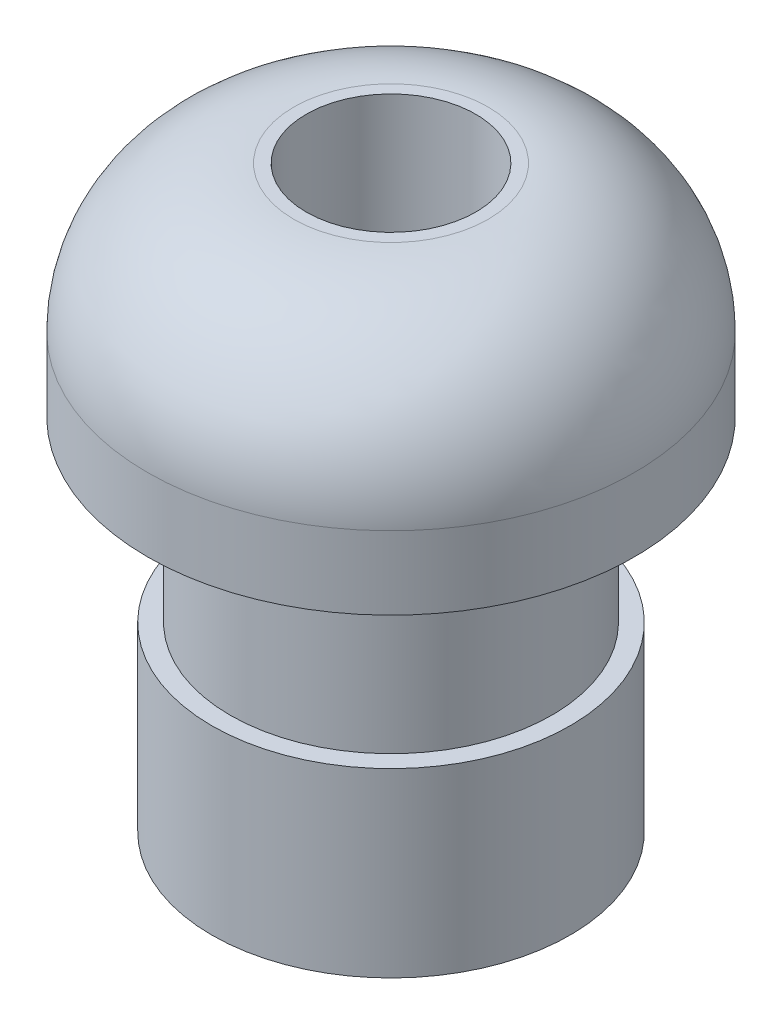
ISO-10303-21;
HEADER;
FILE_DESCRIPTION(('STEP AP214'),'2;1');
FILE_NAME('part.step','',(''),(''),'','','');
FILE_SCHEMA(('AUTOMOTIVE_DESIGN { 1 0 10303 214 1 1 1 1 }'));
ENDSEC;
DATA;
#1=APPLICATION_CONTEXT('core data for automotive mechanical design processes');
#2=APPLICATION_PROTOCOL_DEFINITION('international standard','automotive_design',2000,#1);
#3=PRODUCT_CONTEXT('',#1,'mechanical');
#4=PRODUCT('Part','Part','',(#3));
#5=PRODUCT_RELATED_PRODUCT_CATEGORY('part','',(#4));
#6=PRODUCT_DEFINITION_FORMATION('','',#4);
#7=PRODUCT_DEFINITION_CONTEXT('part definition',#1,'design');
#8=PRODUCT_DEFINITION('design','',#6,#7);
#9=PRODUCT_DEFINITION_SHAPE('','',#8);
#10=(LENGTH_UNIT() NAMED_UNIT(*) SI_UNIT(.MILLI.,.METRE.));
#11=(NAMED_UNIT(*) PLANE_ANGLE_UNIT() SI_UNIT($,.RADIAN.));
#12=(NAMED_UNIT(*) SI_UNIT($,.STERADIAN.) SOLID_ANGLE_UNIT());
#13=UNCERTAINTY_MEASURE_WITH_UNIT(LENGTH_MEASURE(1.E-05),#10,'distance_accuracy_value','');
#14=(GEOMETRIC_REPRESENTATION_CONTEXT(3) GLOBAL_UNCERTAINTY_ASSIGNED_CONTEXT((#13)) GLOBAL_UNIT_ASSIGNED_CONTEXT((#10,
#11,#12)) REPRESENTATION_CONTEXT('',''));
#15=CARTESIAN_POINT('',(0.,0.,0.));
#16=DIRECTION('',(0.,0.,1.));
#17=DIRECTION('',(1.,0.,0.));
#18=AXIS2_PLACEMENT_3D('',#15,#16,#17);
#19=CARTESIAN_POINT('',(0.,3.1496,0.));
#20=DIRECTION('',(0.,-1.,0.));
#21=DIRECTION('',(0.,0.,-1.));
#22=AXIS2_PLACEMENT_3D('',#19,#20,#21);
#23=CYLINDRICAL_SURFACE('',#22,3.1115);
#24=CARTESIAN_POINT('',(0.,3.1496,0.));
#25=DIRECTION('',(0.,1.,0.));
#26=DIRECTION('',(0.,0.,1.));
#27=AXIS2_PLACEMENT_3D('',#24,#25,#26);
#28=CIRCLE('',#27,3.1115);
#29=CARTESIAN_POINT('',(0.,3.1496,3.1115));
#30=VERTEX_POINT('',#29);
#31=EDGE_CURVE('E46',#30,#30,#28,.T.);
#32=ORIENTED_EDGE('',*,*,#31,.F.);
#33=EDGE_LOOP('',(#32));
#34=FACE_BOUND('',#33,.T.);
#35=CARTESIAN_POINT('',(0.,0.,0.));
#36=DIRECTION('',(0.,1.,0.));
#37=DIRECTION('',(0.,0.,1.));
#38=AXIS2_PLACEMENT_3D('',#35,#36,#37);
#39=CIRCLE('',#38,3.1115);
#40=CARTESIAN_POINT('',(0.,0.,3.1115));
#41=VERTEX_POINT('',#40);
#42=EDGE_CURVE('E54',#41,#41,#39,.T.);
#43=ORIENTED_EDGE('',*,*,#42,.T.);
#44=EDGE_LOOP('',(#43));
#45=FACE_BOUND('',#44,.T.);
#46=ADVANCED_FACE('F31',(#34,#45),#23,.T.);
#47=CARTESIAN_POINT('',(0.,3.1496,0.));
#48=DIRECTION('',(0.,1.,0.));
#49=DIRECTION('',(0.,0.,1.));
#50=AXIS2_PLACEMENT_3D('',#47,#48,#49);
#51=PLANE('',#50);
#52=CARTESIAN_POINT('',(0.,3.1496,0.));
#53=DIRECTION('',(0.,1.,0.));
#54=DIRECTION('',(0.,0.,1.));
#55=AXIS2_PLACEMENT_3D('',#52,#53,#54);
#56=CIRCLE('',#55,2.794);
#57=CARTESIAN_POINT('',(0.,3.1496,2.794));
#58=VERTEX_POINT('',#57);
#59=EDGE_CURVE('E42',#58,#58,#56,.T.);
#60=ORIENTED_EDGE('',*,*,#59,.F.);
#61=EDGE_LOOP('',(#60));
#62=FACE_BOUND('',#61,.T.);
#63=ORIENTED_EDGE('',*,*,#31,.T.);
#64=EDGE_LOOP('',(#63));
#65=FACE_BOUND('',#64,.T.);
#66=ADVANCED_FACE('F85',(#62,#65),#51,.T.);
#67=CARTESIAN_POINT('',(0.,0.,0.));
#68=DIRECTION('',(0.,1.,0.));
#69=DIRECTION('',(0.,0.,1.));
#70=AXIS2_PLACEMENT_3D('',#67,#68,#69);
#71=PLANE('',#70);
#72=CARTESIAN_POINT('',(0.,0.,0.));
#73=DIRECTION('',(0.,1.,0.));
#74=DIRECTION('',(0.,0.,1.));
#75=AXIS2_PLACEMENT_3D('',#72,#73,#74);
#76=CIRCLE('',#75,1.4732);
#77=CARTESIAN_POINT('',(0.,0.,1.4732));
#78=VERTEX_POINT('',#77);
#79=EDGE_CURVE('E53',#78,#78,#76,.T.);
#80=ORIENTED_EDGE('',*,*,#79,.T.);
#81=EDGE_LOOP('',(#80));
#82=FACE_BOUND('',#81,.T.);
#83=ORIENTED_EDGE('',*,*,#42,.F.);
#84=EDGE_LOOP('',(#83));
#85=FACE_BOUND('',#84,.T.);
#86=ADVANCED_FACE('F67',(#82,#85),#71,.F.);
#87=CARTESIAN_POINT('',(0.,6.2484,0.));
#88=DIRECTION('',(0.,-1.,0.));
#89=DIRECTION('',(0.,0.,-1.));
#90=AXIS2_PLACEMENT_3D('',#87,#88,#89);
#91=CYLINDRICAL_SURFACE('',#90,2.794);
#92=CARTESIAN_POINT('',(0.,6.2484,0.));
#93=DIRECTION('',(0.,1.,0.));
#94=DIRECTION('',(0.,0.,1.));
#95=AXIS2_PLACEMENT_3D('',#92,#93,#94);
#96=CIRCLE('',#95,2.794);
#97=CARTESIAN_POINT('',(0.,6.2484,2.794));
#98=VERTEX_POINT('',#97);
#99=EDGE_CURVE('E57',#98,#98,#96,.T.);
#100=ORIENTED_EDGE('',*,*,#99,.F.);
#101=EDGE_LOOP('',(#100));
#102=FACE_BOUND('',#101,.T.);
#103=ORIENTED_EDGE('',*,*,#59,.T.);
#104=EDGE_LOOP('',(#103));
#105=FACE_BOUND('',#104,.T.);
#106=ADVANCED_FACE('F96',(#102,#105),#91,.T.);
#107=CARTESIAN_POINT('',(0.,10.0584,0.));
#108=DIRECTION('',(0.,-1.,0.));
#109=DIRECTION('',(0.,0.,-1.));
#110=AXIS2_PLACEMENT_3D('',#107,#108,#109);
#111=CYLINDRICAL_SURFACE('',#110,4.2291);
#112=CARTESIAN_POINT('',(0.,7.5184,0.));
#113=DIRECTION('',(0.,1.,0.));
#114=DIRECTION('',(0.,0.,1.));
#115=AXIS2_PLACEMENT_3D('',#112,#113,#114);
#116=CIRCLE('',#115,4.2291);
#117=CARTESIAN_POINT('',(0.,7.5184,-4.2291));
#118=VERTEX_POINT('',#117);
#119=EDGE_CURVE('E10',#118,#118,#116,.F.);
#120=CARTESIAN_POINT('',(0.,6.2484,0.));
#121=DIRECTION('',(0.,1.,0.));
#122=DIRECTION('',(0.,0.,1.));
#123=AXIS2_PLACEMENT_3D('',#120,#121,#122);
#124=CIRCLE('',#123,4.2291);
#125=CARTESIAN_POINT('',(0.,6.2484,-4.2291));
#126=VERTEX_POINT('',#125);
#127=EDGE_CURVE('E52',#126,#126,#124,.T.);
#128=CARTESIAN_POINT('',(0.,7.5184,-4.2291));
#129=CARTESIAN_POINT('',(0.,7.50517083333333,-4.2291));
#130=CARTESIAN_POINT('',(0.,7.49194166666666,-4.2291));
#131=CARTESIAN_POINT('',(0.,7.46548333333333,-4.2291));
#132=CARTESIAN_POINT('',(0.,7.45225416666666,-4.2291));
#133=CARTESIAN_POINT('',(0.,7.42579583333333,-4.2291));
#134=CARTESIAN_POINT('',(0.,7.41256666666666,-4.2291));
#135=CARTESIAN_POINT('',(0.,7.38610833333333,-4.2291));
#136=CARTESIAN_POINT('',(0.,7.37287916666666,-4.2291));
#137=CARTESIAN_POINT('',(0.,7.34642083333333,-4.2291));
#138=CARTESIAN_POINT('',(0.,7.33319166666666,-4.2291));
#139=CARTESIAN_POINT('',(0.,7.30673333333333,-4.2291));
#140=CARTESIAN_POINT('',(0.,7.29350416666666,-4.2291));
#141=CARTESIAN_POINT('',(0.,7.26704583333333,-4.2291));
#142=CARTESIAN_POINT('',(0.,7.25381666666666,-4.2291));
#143=CARTESIAN_POINT('',(0.,7.22735833333333,-4.2291));
#144=CARTESIAN_POINT('',(0.,7.21412916666666,-4.2291));
#145=CARTESIAN_POINT('',(0.,7.18767083333333,-4.2291));
#146=CARTESIAN_POINT('',(0.,7.17444166666666,-4.2291));
#147=CARTESIAN_POINT('',(0.,7.14798333333333,-4.2291));
#148=CARTESIAN_POINT('',(0.,7.13475416666666,-4.2291));
#149=CARTESIAN_POINT('',(0.,7.10829583333333,-4.2291));
#150=CARTESIAN_POINT('',(0.,7.09506666666666,-4.2291));
#151=CARTESIAN_POINT('',(0.,7.06860833333333,-4.2291));
#152=CARTESIAN_POINT('',(0.,7.05537916666666,-4.2291));
#153=CARTESIAN_POINT('',(0.,7.02892083333333,-4.2291));
#154=CARTESIAN_POINT('',(0.,7.01569166666666,-4.2291));
#155=CARTESIAN_POINT('',(0.,6.98923333333333,-4.2291));
#156=CARTESIAN_POINT('',(0.,6.97600416666666,-4.2291));
#157=CARTESIAN_POINT('',(0.,6.94954583333333,-4.2291));
#158=CARTESIAN_POINT('',(0.,6.93631666666666,-4.2291));
#159=CARTESIAN_POINT('',(0.,6.90985833333333,-4.2291));
#160=CARTESIAN_POINT('',(0.,6.89662916666666,-4.2291));
#161=CARTESIAN_POINT('',(0.,6.87017083333333,-4.2291));
#162=CARTESIAN_POINT('',(0.,6.85694166666666,-4.2291));
#163=CARTESIAN_POINT('',(0.,6.83048333333333,-4.2291));
#164=CARTESIAN_POINT('',(0.,6.81725416666666,-4.2291));
#165=CARTESIAN_POINT('',(0.,6.79079583333333,-4.2291));
#166=CARTESIAN_POINT('',(0.,6.77756666666666,-4.2291));
#167=CARTESIAN_POINT('',(0.,6.75110833333333,-4.2291));
#168=CARTESIAN_POINT('',(0.,6.73787916666666,-4.2291));
#169=CARTESIAN_POINT('',(0.,6.71142083333333,-4.2291));
#170=CARTESIAN_POINT('',(0.,6.69819166666666,-4.2291));
#171=CARTESIAN_POINT('',(0.,6.67173333333333,-4.2291));
#172=CARTESIAN_POINT('',(0.,6.65850416666666,-4.2291));
#173=CARTESIAN_POINT('',(0.,6.63204583333333,-4.2291));
#174=CARTESIAN_POINT('',(0.,6.61881666666666,-4.2291));
#175=CARTESIAN_POINT('',(0.,6.59235833333333,-4.2291));
#176=CARTESIAN_POINT('',(0.,6.57912916666666,-4.2291));
#177=CARTESIAN_POINT('',(0.,6.55267083333333,-4.2291));
#178=CARTESIAN_POINT('',(0.,6.53944166666666,-4.2291));
#179=CARTESIAN_POINT('',(0.,6.51298333333333,-4.2291));
#180=CARTESIAN_POINT('',(0.,6.49975416666666,-4.2291));
#181=CARTESIAN_POINT('',(0.,6.47329583333333,-4.2291));
#182=CARTESIAN_POINT('',(0.,6.46006666666667,-4.2291));
#183=CARTESIAN_POINT('',(0.,6.43360833333333,-4.2291));
#184=CARTESIAN_POINT('',(0.,6.42037916666666,-4.2291));
#185=CARTESIAN_POINT('',(0.,6.39392083333333,-4.2291));
#186=CARTESIAN_POINT('',(0.,6.38069166666667,-4.2291));
#187=CARTESIAN_POINT('',(0.,6.35423333333333,-4.2291));
#188=CARTESIAN_POINT('',(0.,6.34100416666667,-4.2291));
#189=CARTESIAN_POINT('',(0.,6.31454583333333,-4.2291));
#190=CARTESIAN_POINT('',(0.,6.30131666666667,-4.2291));
#191=CARTESIAN_POINT('',(0.,6.27485833333333,-4.2291));
#192=CARTESIAN_POINT('',(0.,6.26162916666667,-4.2291));
#193=CARTESIAN_POINT('',(0.,6.2484,-4.2291));
#194=B_SPLINE_CURVE_WITH_KNOTS('',3,(#128,#129,#130,#131,#132,#133,#134,#135,#136,#137,#138,
#139,#140,#141,#142,#143,#144,#145,#146,#147,#148,#149,#150,#151,#152,#153,#154,#155,#156,#157,
#158,#159,#160,#161,#162,#163,#164,#165,#166,#167,#168,#169,#170,#171,#172,#173,#174,#175,#176,
#177,#178,#179,#180,#181,#182,#183,#184,#185,#186,#187,#188,#189,#190,#191,#192,#193),
.UNSPECIFIED.,.F.,.F.,(4,2,2,2,2,2,2,2,2,2,2,2,2,2,2,2,2,2,2,2,2,2,2,2,2,2,2,2,2,2,2,2,4),(0.,
0.0396874999999998,0.0793749999999996,0.1190625,0.15875,0.1984375,0.238125,0.2778125,0.3175,
0.3571875,0.396875,0.436562499999999,0.476249999999999,0.515937499999999,0.555624999999999,
0.595312499999999,0.634999999999998,0.674687499999998,0.714374999999998,0.754062499999999,
0.793749999999998,0.833437499999998,0.873124999999999,0.912812499999999,0.952499999999998,
0.992187499999998,1.031875,1.0715625,1.11125,1.1509375,1.190625,1.2303125,1.27),.UNSPECIFIED.);
#195=EDGE_CURVE('BSEAM100',#118,#126,#194,.T.);
#196=ORIENTED_EDGE('',*,*,#119,.T.);
#197=ORIENTED_EDGE('',*,*,#127,.T.);
#198=ORIENTED_EDGE('',*,*,#195,.T.);
#199=ORIENTED_EDGE('',*,*,#195,.F.);
#200=EDGE_LOOP('',(#196,#198,#197,#199));
#201=FACE_BOUND('',#200,.T.);
#202=ADVANCED_FACE('F100',(#201),#111,.T.);
#203=CARTESIAN_POINT('',(0.,10.0584,0.));
#204=DIRECTION('',(0.,1.,0.));
#205=DIRECTION('',(0.,0.,1.));
#206=AXIS2_PLACEMENT_3D('',#203,#204,#205);
#207=PLANE('',#206);
#208=CARTESIAN_POINT('',(0.,10.0584,0.));
#209=DIRECTION('',(0.,1.,0.));
#210=DIRECTION('',(0.,0.,1.));
#211=AXIS2_PLACEMENT_3D('',#208,#209,#210);
#212=CIRCLE('',#211,1.6891);
#213=CARTESIAN_POINT('',(0.,10.0584,1.6891));
#214=VERTEX_POINT('',#213);
#215=EDGE_CURVE('E38',#214,#214,#212,.T.);
#216=ORIENTED_EDGE('',*,*,#215,.T.);
#217=EDGE_LOOP('',(#216));
#218=FACE_BOUND('',#217,.T.);
#219=CARTESIAN_POINT('',(0.,10.0584,0.));
#220=DIRECTION('',(0.,1.,0.));
#221=DIRECTION('',(0.,0.,1.));
#222=AXIS2_PLACEMENT_3D('',#219,#220,#221);
#223=CIRCLE('',#222,1.4732);
#224=CARTESIAN_POINT('',(0.,10.0584,1.4732));
#225=VERTEX_POINT('',#224);
#226=EDGE_CURVE('E49',#225,#225,#223,.T.);
#227=ORIENTED_EDGE('',*,*,#226,.F.);
#228=EDGE_LOOP('',(#227));
#229=FACE_BOUND('',#228,.T.);
#230=ADVANCED_FACE('F80',(#218,#229),#207,.T.);
#231=CARTESIAN_POINT('',(0.,6.2484,0.));
#232=DIRECTION('',(0.,1.,0.));
#233=DIRECTION('',(0.,0.,1.));
#234=AXIS2_PLACEMENT_3D('',#231,#232,#233);
#235=PLANE('',#234);
#236=ORIENTED_EDGE('',*,*,#99,.T.);
#237=EDGE_LOOP('',(#236));
#238=FACE_BOUND('',#237,.T.);
#239=ORIENTED_EDGE('',*,*,#127,.F.);
#240=EDGE_LOOP('',(#239));
#241=FACE_BOUND('',#240,.T.);
#242=ADVANCED_FACE('F72',(#238,#241),#235,.F.);
#243=CARTESIAN_POINT('',(0.,0.,0.));
#244=DIRECTION('',(0.,1.,0.));
#245=DIRECTION('',(0.,0.,1.));
#246=AXIS2_PLACEMENT_3D('',#243,#244,#245);
#247=CYLINDRICAL_SURFACE('',#246,1.4732);
#248=ORIENTED_EDGE('',*,*,#226,.T.);
#249=EDGE_LOOP('',(#248));
#250=FACE_BOUND('',#249,.T.);
#251=ORIENTED_EDGE('',*,*,#79,.F.);
#252=EDGE_LOOP('',(#251));
#253=FACE_BOUND('',#252,.T.);
#254=ADVANCED_FACE('F70',(#250,#253),#247,.F.);
#255=CARTESIAN_POINT('',(0.,7.5184,0.));
#256=DIRECTION('',(0.,1.,0.));
#257=DIRECTION('',(0.,0.,1.));
#258=AXIS2_PLACEMENT_3D('',#255,#256,#257);
#259=DEGENERATE_TOROIDAL_SURFACE('',#258,1.6891,2.54,.T.);
#260=ORIENTED_EDGE('',*,*,#119,.F.);
#261=EDGE_LOOP('',(#260));
#262=FACE_BOUND('',#261,.T.);
#263=ORIENTED_EDGE('',*,*,#215,.F.);
#264=EDGE_LOOP('',(#263));
#265=FACE_BOUND('',#264,.T.);
#266=ADVANCED_FACE('F33',(#262,#265),#259,.T.);
#267=CLOSED_SHELL('',(#46,#66,#86,#106,#202,#230,#242,#254,#266));
#268=MANIFOLD_SOLID_BREP('B2',#267);
#269=ADVANCED_BREP_SHAPE_REPRESENTATION('',(#18,#268),#14);
#270=SHAPE_DEFINITION_REPRESENTATION(#9,#269);
ENDSEC;
END-ISO-10303-21;
